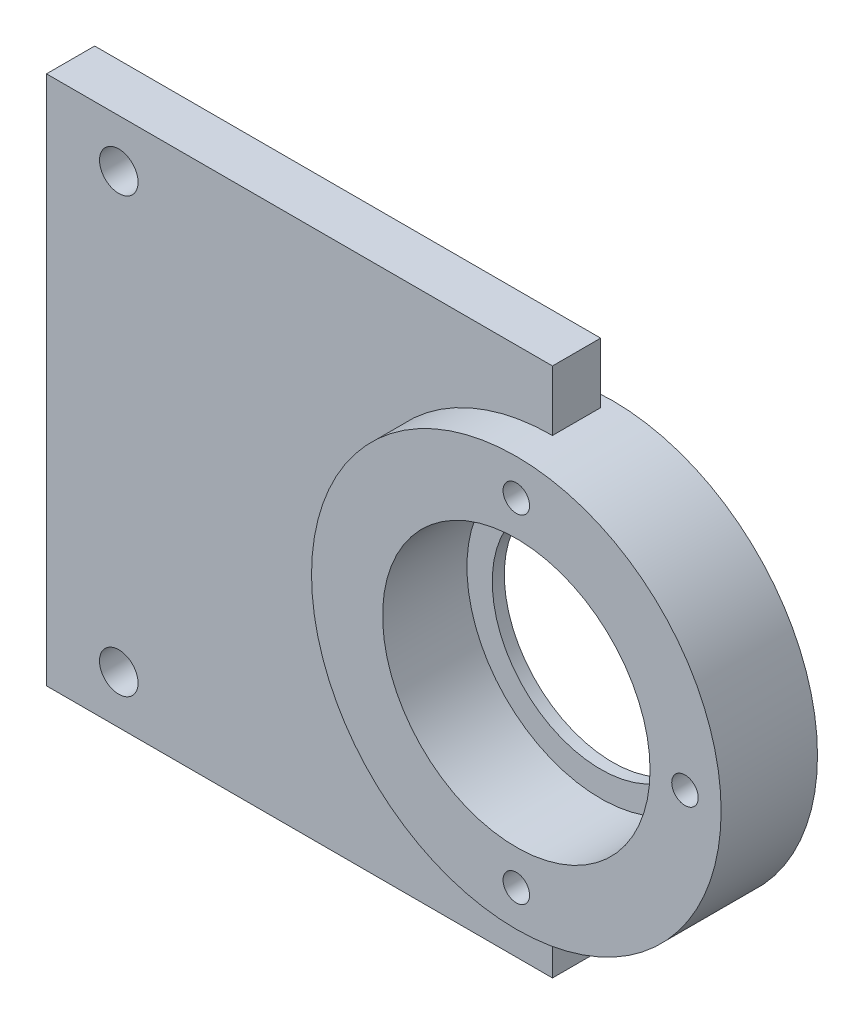
ISO-10303-21;
HEADER;
FILE_DESCRIPTION(('STEP AP214'),'2;1');
FILE_NAME('part.step','',(''),(''),'','','');
FILE_SCHEMA(('AUTOMOTIVE_DESIGN { 1 0 10303 214 1 1 1 1 }'));
ENDSEC;
DATA;
#1=APPLICATION_CONTEXT('core data for automotive mechanical design processes');
#2=APPLICATION_PROTOCOL_DEFINITION('international standard','automotive_design',2000,#1);
#3=PRODUCT_CONTEXT('',#1,'mechanical');
#4=PRODUCT('Part','Part','',(#3));
#5=PRODUCT_RELATED_PRODUCT_CATEGORY('part','',(#4));
#6=PRODUCT_DEFINITION_FORMATION('','',#4);
#7=PRODUCT_DEFINITION_CONTEXT('part definition',#1,'design');
#8=PRODUCT_DEFINITION('design','',#6,#7);
#9=PRODUCT_DEFINITION_SHAPE('','',#8);
#10=(LENGTH_UNIT() NAMED_UNIT(*) SI_UNIT(.MILLI.,.METRE.));
#11=(NAMED_UNIT(*) PLANE_ANGLE_UNIT() SI_UNIT($,.RADIAN.));
#12=(NAMED_UNIT(*) SI_UNIT($,.STERADIAN.) SOLID_ANGLE_UNIT());
#13=UNCERTAINTY_MEASURE_WITH_UNIT(LENGTH_MEASURE(1.E-05),#10,'distance_accuracy_value','');
#14=(GEOMETRIC_REPRESENTATION_CONTEXT(3) GLOBAL_UNCERTAINTY_ASSIGNED_CONTEXT((#13)) GLOBAL_UNIT_ASSIGNED_CONTEXT((#10,
#11,#12)) REPRESENTATION_CONTEXT('',''));
#15=CARTESIAN_POINT('',(0.,0.,0.));
#16=DIRECTION('',(0.,0.,1.));
#17=DIRECTION('',(1.,0.,0.));
#18=AXIS2_PLACEMENT_3D('',#15,#16,#17);
#19=CARTESIAN_POINT('',(0.,0.,0.));
#20=DIRECTION('',(0.,0.,1.));
#21=DIRECTION('',(1.,0.,0.));
#22=AXIS2_PLACEMENT_3D('',#19,#20,#21);
#23=PLANE('',#22);
#24=CARTESIAN_POINT('',(-36.,-18.,0.));
#25=DIRECTION('',(0.,0.,1.));
#26=DIRECTION('',(1.,0.,0.));
#27=AXIS2_PLACEMENT_3D('',#24,#25,#26);
#28=CIRCLE('',#27,1.6);
#29=CARTESIAN_POINT('',(-37.6,-18.,0.));
#30=VERTEX_POINT('',#29);
#31=EDGE_CURVE('E167',#30,#30,#28,.F.);
#32=ORIENTED_EDGE('',*,*,#31,.F.);
#33=EDGE_LOOP('',(#32));
#34=FACE_BOUND('',#33,.T.);
#35=CARTESIAN_POINT('',(-36.,18.,0.));
#36=DIRECTION('',(0.,0.,1.));
#37=DIRECTION('',(1.,0.,0.));
#38=AXIS2_PLACEMENT_3D('',#35,#36,#37);
#39=CIRCLE('',#38,1.6);
#40=CARTESIAN_POINT('',(-37.6,18.,0.));
#41=VERTEX_POINT('',#40);
#42=EDGE_CURVE('E161',#41,#41,#39,.F.);
#43=ORIENTED_EDGE('',*,*,#42,.F.);
#44=EDGE_LOOP('',(#43));
#45=FACE_BOUND('',#44,.T.);
#46=DIRECTION('',(0.,1.,0.));
#47=VECTOR('',#46,1.);
#48=CARTESIAN_POINT('',(0.,-22.,0.));
#49=LINE('',#48,#47);
#50=CARTESIAN_POINT('',(0.,17.,0.));
#51=VERTEX_POINT('',#50);
#52=CARTESIAN_POINT('',(0.,22.,0.));
#53=VERTEX_POINT('',#52);
#54=EDGE_CURVE('E103',#51,#53,#49,.T.);
#55=ORIENTED_EDGE('',*,*,#54,.F.);
#56=CARTESIAN_POINT('',(0.,0.,0.));
#57=DIRECTION('',(0.,0.,1.));
#58=DIRECTION('',(1.,0.,0.));
#59=AXIS2_PLACEMENT_3D('',#56,#57,#58);
#60=CIRCLE('',#59,17.);
#61=CARTESIAN_POINT('',(0.,-17.,0.));
#62=VERTEX_POINT('',#61);
#63=EDGE_CURVE('E70',#51,#62,#60,.T.);
#64=ORIENTED_EDGE('',*,*,#63,.T.);
#65=CARTESIAN_POINT('',(0.,-22.,0.));
#66=VERTEX_POINT('',#65);
#67=EDGE_CURVE('E101',#66,#62,#49,.T.);
#68=ORIENTED_EDGE('',*,*,#67,.F.);
#69=DIRECTION('',(1.,0.,0.));
#70=VECTOR('',#69,1.);
#71=CARTESIAN_POINT('',(-42.,-22.,0.));
#72=LINE('',#71,#70);
#73=CARTESIAN_POINT('',(-42.,-22.,0.));
#74=VERTEX_POINT('',#73);
#75=EDGE_CURVE('E130',#74,#66,#72,.T.);
#76=ORIENTED_EDGE('',*,*,#75,.F.);
#77=DIRECTION('',(0.,-1.,0.));
#78=VECTOR('',#77,1.);
#79=CARTESIAN_POINT('',(-42.,-22.,0.));
#80=LINE('',#79,#78);
#81=CARTESIAN_POINT('',(-42.,22.,0.));
#82=VERTEX_POINT('',#81);
#83=EDGE_CURVE('E104',#82,#74,#80,.T.);
#84=ORIENTED_EDGE('',*,*,#83,.F.);
#85=DIRECTION('',(-1.,0.,0.));
#86=VECTOR('',#85,1.);
#87=CARTESIAN_POINT('',(-42.,22.,0.));
#88=LINE('',#87,#86);
#89=EDGE_CURVE('E124',#53,#82,#88,.T.);
#90=ORIENTED_EDGE('',*,*,#89,.F.);
#91=EDGE_LOOP('',(#55,#64,#68,#76,#84,#90));
#92=FACE_BOUND('',#91,.T.);
#93=ADVANCED_FACE('F44',(#34,#45,#92),#23,.F.);
#94=CARTESIAN_POINT('',(0.,0.,7.));
#95=DIRECTION('',(0.,0.,-1.));
#96=DIRECTION('',(-1.,0.,0.));
#97=AXIS2_PLACEMENT_3D('',#94,#95,#96);
#98=CYLINDRICAL_SURFACE('',#97,17.);
#99=CARTESIAN_POINT('',(0.,0.,7.));
#100=DIRECTION('',(0.,0.,1.));
#101=DIRECTION('',(1.,0.,0.));
#102=AXIS2_PLACEMENT_3D('',#99,#100,#101);
#103=CIRCLE('',#102,17.);
#104=CARTESIAN_POINT('',(17.,0.,7.));
#105=VERTEX_POINT('',#104);
#106=EDGE_CURVE('E11',#105,#105,#103,.T.);
#107=ORIENTED_EDGE('',*,*,#106,.F.);
#108=EDGE_LOOP('',(#107));
#109=FACE_BOUND('',#108,.T.);
#110=DIRECTION('',(0.,0.,-1.));
#111=VECTOR('',#110,1.);
#112=CARTESIAN_POINT('',(0.,17.,7.));
#113=LINE('',#112,#111);
#114=CARTESIAN_POINT('',(0.,17.,4.));
#115=VERTEX_POINT('',#114);
#116=EDGE_CURVE('E111',#115,#51,#113,.T.);
#117=ORIENTED_EDGE('',*,*,#116,.F.);
#118=CARTESIAN_POINT('',(0.,0.,4.));
#119=DIRECTION('',(0.,0.,-1.));
#120=DIRECTION('',(-1.,0.,0.));
#121=AXIS2_PLACEMENT_3D('',#118,#119,#120);
#122=CIRCLE('',#121,17.);
#123=CARTESIAN_POINT('',(0.,-17.,4.));
#124=VERTEX_POINT('',#123);
#125=EDGE_CURVE('E65',#124,#115,#122,.T.);
#126=ORIENTED_EDGE('',*,*,#125,.F.);
#127=DIRECTION('',(0.,0.,-1.));
#128=VECTOR('',#127,1.);
#129=CARTESIAN_POINT('',(0.,-17.,7.));
#130=LINE('',#129,#128);
#131=EDGE_CURVE('E107',#62,#124,#130,.F.);
#132=ORIENTED_EDGE('',*,*,#131,.F.);
#133=ORIENTED_EDGE('',*,*,#63,.F.);
#134=EDGE_LOOP('',(#117,#126,#132,#133));
#135=FACE_BOUND('',#134,.T.);
#136=CARTESIAN_POINT('',(0.,0.,-1.));
#137=DIRECTION('',(0.,0.,1.));
#138=DIRECTION('',(1.,0.,0.));
#139=AXIS2_PLACEMENT_3D('',#136,#137,#138);
#140=CIRCLE('',#139,17.);
#141=CARTESIAN_POINT('',(17.,0.,-1.));
#142=VERTEX_POINT('',#141);
#143=EDGE_CURVE('E106',#142,#142,#140,.T.);
#144=ORIENTED_EDGE('',*,*,#143,.T.);
#145=EDGE_LOOP('',(#144));
#146=FACE_BOUND('',#145,.T.);
#147=ADVANCED_FACE('F50',(#109,#135,#146),#98,.T.);
#148=CARTESIAN_POINT('',(0.,0.,7.));
#149=DIRECTION('',(0.,0.,-1.));
#150=DIRECTION('',(-1.,0.,0.));
#151=AXIS2_PLACEMENT_3D('',#148,#149,#150);
#152=CYLINDRICAL_SURFACE('',#151,11.1);
#153=CARTESIAN_POINT('',(0.,0.,0.));
#154=DIRECTION('',(0.,0.,1.));
#155=DIRECTION('',(1.,0.,0.));
#156=AXIS2_PLACEMENT_3D('',#153,#154,#155);
#157=CIRCLE('',#156,11.1);
#158=CARTESIAN_POINT('',(11.1,0.,0.));
#159=VERTEX_POINT('',#158);
#160=EDGE_CURVE('E147',#159,#159,#157,.T.);
#161=ORIENTED_EDGE('',*,*,#160,.F.);
#162=EDGE_LOOP('',(#161));
#163=FACE_BOUND('',#162,.T.);
#164=CARTESIAN_POINT('',(0.,0.,7.));
#165=DIRECTION('',(0.,0.,1.));
#166=DIRECTION('',(1.,0.,0.));
#167=AXIS2_PLACEMENT_3D('',#164,#165,#166);
#168=CIRCLE('',#167,11.1);
#169=CARTESIAN_POINT('',(11.1,0.,7.));
#170=VERTEX_POINT('',#169);
#171=EDGE_CURVE('E54',#170,#170,#168,.T.);
#172=ORIENTED_EDGE('',*,*,#171,.T.);
#173=EDGE_LOOP('',(#172));
#174=FACE_BOUND('',#173,.T.);
#175=ADVANCED_FACE('F247',(#163,#174),#152,.F.);
#176=CARTESIAN_POINT('',(0.,0.,7.));
#177=DIRECTION('',(0.,0.,1.));
#178=DIRECTION('',(1.,0.,0.));
#179=AXIS2_PLACEMENT_3D('',#176,#177,#178);
#180=PLANE('',#179);
#181=CARTESIAN_POINT('',(14.,0.,7.));
#182=DIRECTION('',(0.,0.,1.));
#183=DIRECTION('',(1.,0.,0.));
#184=AXIS2_PLACEMENT_3D('',#181,#182,#183);
#185=CIRCLE('',#184,1.1);
#186=CARTESIAN_POINT('',(12.9,0.,7.));
#187=VERTEX_POINT('',#186);
#188=EDGE_CURVE('E174',#187,#187,#185,.T.);
#189=ORIENTED_EDGE('',*,*,#188,.F.);
#190=EDGE_LOOP('',(#189));
#191=FACE_BOUND('',#190,.T.);
#192=CARTESIAN_POINT('',(0.,-14.,7.));
#193=DIRECTION('',(0.,0.,1.));
#194=DIRECTION('',(1.,0.,0.));
#195=AXIS2_PLACEMENT_3D('',#192,#193,#194);
#196=CIRCLE('',#195,1.1);
#197=CARTESIAN_POINT('',(-1.1,-14.,7.));
#198=VERTEX_POINT('',#197);
#199=EDGE_CURVE('E308',#198,#198,#196,.T.);
#200=ORIENTED_EDGE('',*,*,#199,.F.);
#201=EDGE_LOOP('',(#200));
#202=FACE_BOUND('',#201,.T.);
#203=CARTESIAN_POINT('',(0.,14.,7.));
#204=DIRECTION('',(0.,0.,1.));
#205=DIRECTION('',(1.,0.,0.));
#206=AXIS2_PLACEMENT_3D('',#203,#204,#205);
#207=CIRCLE('',#206,1.1);
#208=CARTESIAN_POINT('',(-1.1,14.,7.));
#209=VERTEX_POINT('',#208);
#210=EDGE_CURVE('E309',#209,#209,#207,.T.);
#211=ORIENTED_EDGE('',*,*,#210,.F.);
#212=EDGE_LOOP('',(#211));
#213=FACE_BOUND('',#212,.T.);
#214=ORIENTED_EDGE('',*,*,#106,.T.);
#215=EDGE_LOOP('',(#214));
#216=FACE_BOUND('',#215,.T.);
#217=ORIENTED_EDGE('',*,*,#171,.F.);
#218=EDGE_LOOP('',(#217));
#219=FACE_BOUND('',#218,.T.);
#220=ADVANCED_FACE('F245',(#191,#202,#213,#216,#219),#180,.T.);
#221=CARTESIAN_POINT('',(0.,-22.,4.));
#222=DIRECTION('',(-1.,0.,0.));
#223=DIRECTION('',(0.,0.,1.));
#224=AXIS2_PLACEMENT_3D('',#221,#222,#223);
#225=PLANE('',#224);
#226=DIRECTION('',(0.,1.,0.));
#227=VECTOR('',#226,1.);
#228=CARTESIAN_POINT('',(0.,-22.,4.));
#229=LINE('',#228,#227);
#230=CARTESIAN_POINT('',(0.,22.,4.));
#231=VERTEX_POINT('',#230);
#232=EDGE_CURVE('E216',#115,#231,#229,.T.);
#233=ORIENTED_EDGE('',*,*,#232,.F.);
#234=ORIENTED_EDGE('',*,*,#116,.T.);
#235=ORIENTED_EDGE('',*,*,#54,.T.);
#236=DIRECTION('',(0.,0.,-1.));
#237=VECTOR('',#236,1.);
#238=CARTESIAN_POINT('',(0.,22.,4.));
#239=LINE('',#238,#237);
#240=EDGE_CURVE('E132',#231,#53,#239,.T.);
#241=ORIENTED_EDGE('',*,*,#240,.F.);
#242=EDGE_LOOP('',(#233,#234,#235,#241));
#243=FACE_BOUND('',#242,.T.);
#244=ADVANCED_FACE('F244',(#243),#225,.F.);
#245=ORIENTED_EDGE('',*,*,#67,.T.);
#246=ORIENTED_EDGE('',*,*,#131,.T.);
#247=CARTESIAN_POINT('',(0.,-22.,4.));
#248=VERTEX_POINT('',#247);
#249=EDGE_CURVE('E220',#248,#124,#229,.T.);
#250=ORIENTED_EDGE('',*,*,#249,.F.);
#251=DIRECTION('',(0.,0.,-1.));
#252=VECTOR('',#251,1.);
#253=CARTESIAN_POINT('',(0.,-22.,4.));
#254=LINE('',#253,#252);
#255=EDGE_CURVE('E118',#248,#66,#254,.T.);
#256=ORIENTED_EDGE('',*,*,#255,.T.);
#257=EDGE_LOOP('',(#245,#246,#250,#256));
#258=FACE_BOUND('',#257,.T.);
#259=ADVANCED_FACE('F116',(#258),#225,.F.);
#260=CARTESIAN_POINT('',(-42.,-22.,4.));
#261=DIRECTION('',(1.,0.,0.));
#262=DIRECTION('',(0.,0.,-1.));
#263=AXIS2_PLACEMENT_3D('',#260,#261,#262);
#264=PLANE('',#263);
#265=ORIENTED_EDGE('',*,*,#83,.T.);
#266=DIRECTION('',(0.,0.,-1.));
#267=VECTOR('',#266,1.);
#268=CARTESIAN_POINT('',(-42.,-22.,4.));
#269=LINE('',#268,#267);
#270=CARTESIAN_POINT('',(-42.,-22.,4.));
#271=VERTEX_POINT('',#270);
#272=EDGE_CURVE('E142',#271,#74,#269,.T.);
#273=ORIENTED_EDGE('',*,*,#272,.F.);
#274=DIRECTION('',(0.,-1.,0.));
#275=VECTOR('',#274,1.);
#276=CARTESIAN_POINT('',(-42.,-22.,4.));
#277=LINE('',#276,#275);
#278=CARTESIAN_POINT('',(-42.,22.,4.));
#279=VERTEX_POINT('',#278);
#280=EDGE_CURVE('E122',#279,#271,#277,.T.);
#281=ORIENTED_EDGE('',*,*,#280,.F.);
#282=DIRECTION('',(0.,0.,-1.));
#283=VECTOR('',#282,1.);
#284=CARTESIAN_POINT('',(-42.,22.,4.));
#285=LINE('',#284,#283);
#286=EDGE_CURVE('E134',#279,#82,#285,.T.);
#287=ORIENTED_EDGE('',*,*,#286,.T.);
#288=EDGE_LOOP('',(#265,#273,#281,#287));
#289=FACE_BOUND('',#288,.T.);
#290=ADVANCED_FACE('F232',(#289),#264,.F.);
#291=CARTESIAN_POINT('',(-42.,-22.,4.));
#292=DIRECTION('',(0.,1.,0.));
#293=DIRECTION('',(0.,0.,1.));
#294=AXIS2_PLACEMENT_3D('',#291,#292,#293);
#295=PLANE('',#294);
#296=ORIENTED_EDGE('',*,*,#75,.T.);
#297=ORIENTED_EDGE('',*,*,#255,.F.);
#298=DIRECTION('',(1.,0.,0.));
#299=VECTOR('',#298,1.);
#300=CARTESIAN_POINT('',(-42.,-22.,4.));
#301=LINE('',#300,#299);
#302=EDGE_CURVE('E213',#271,#248,#301,.T.);
#303=ORIENTED_EDGE('',*,*,#302,.F.);
#304=ORIENTED_EDGE('',*,*,#272,.T.);
#305=EDGE_LOOP('',(#296,#297,#303,#304));
#306=FACE_BOUND('',#305,.T.);
#307=ADVANCED_FACE('F230',(#306),#295,.F.);
#308=CARTESIAN_POINT('',(-42.,22.,4.));
#309=DIRECTION('',(0.,-1.,0.));
#310=DIRECTION('',(0.,0.,-1.));
#311=AXIS2_PLACEMENT_3D('',#308,#309,#310);
#312=PLANE('',#311);
#313=ORIENTED_EDGE('',*,*,#89,.T.);
#314=ORIENTED_EDGE('',*,*,#286,.F.);
#315=DIRECTION('',(-1.,0.,0.));
#316=VECTOR('',#315,1.);
#317=CARTESIAN_POINT('',(-42.,22.,4.));
#318=LINE('',#317,#316);
#319=EDGE_CURVE('E139',#231,#279,#318,.T.);
#320=ORIENTED_EDGE('',*,*,#319,.F.);
#321=ORIENTED_EDGE('',*,*,#240,.T.);
#322=EDGE_LOOP('',(#313,#314,#320,#321));
#323=FACE_BOUND('',#322,.T.);
#324=ADVANCED_FACE('F234',(#323),#312,.F.);
#325=CARTESIAN_POINT('',(0.,0.,4.));
#326=DIRECTION('',(0.,0.,-1.));
#327=DIRECTION('',(-1.,0.,0.));
#328=AXIS2_PLACEMENT_3D('',#325,#326,#327);
#329=PLANE('',#328);
#330=CARTESIAN_POINT('',(-36.,-18.,4.));
#331=DIRECTION('',(0.,0.,-1.));
#332=DIRECTION('',(-1.,0.,0.));
#333=AXIS2_PLACEMENT_3D('',#330,#331,#332);
#334=CIRCLE('',#333,1.6);
#335=CARTESIAN_POINT('',(-37.6,-18.,4.));
#336=VERTEX_POINT('',#335);
#337=EDGE_CURVE('E165',#336,#336,#334,.F.);
#338=ORIENTED_EDGE('',*,*,#337,.F.);
#339=EDGE_LOOP('',(#338));
#340=FACE_BOUND('',#339,.T.);
#341=CARTESIAN_POINT('',(-36.,18.,4.));
#342=DIRECTION('',(0.,0.,-1.));
#343=DIRECTION('',(-1.,0.,0.));
#344=AXIS2_PLACEMENT_3D('',#341,#342,#343);
#345=CIRCLE('',#344,1.6);
#346=CARTESIAN_POINT('',(-37.6,18.,4.));
#347=VERTEX_POINT('',#346);
#348=EDGE_CURVE('E160',#347,#347,#345,.F.);
#349=ORIENTED_EDGE('',*,*,#348,.F.);
#350=EDGE_LOOP('',(#349));
#351=FACE_BOUND('',#350,.T.);
#352=ORIENTED_EDGE('',*,*,#249,.T.);
#353=ORIENTED_EDGE('',*,*,#125,.T.);
#354=ORIENTED_EDGE('',*,*,#232,.T.);
#355=ORIENTED_EDGE('',*,*,#319,.T.);
#356=ORIENTED_EDGE('',*,*,#280,.T.);
#357=ORIENTED_EDGE('',*,*,#302,.T.);
#358=EDGE_LOOP('',(#352,#353,#354,#355,#356,#357));
#359=FACE_BOUND('',#358,.T.);
#360=ADVANCED_FACE('F240',(#340,#351,#359),#329,.F.);
#361=CARTESIAN_POINT('',(0.,0.,0.));
#362=DIRECTION('',(0.,0.,1.));
#363=DIRECTION('',(1.,0.,0.));
#364=AXIS2_PLACEMENT_3D('',#361,#362,#363);
#365=PLANE('',#364);
#366=ORIENTED_EDGE('',*,*,#160,.T.);
#367=EDGE_LOOP('',(#366));
#368=FACE_BOUND('',#367,.T.);
#369=CARTESIAN_POINT('',(0.,0.,0.));
#370=DIRECTION('',(0.,0.,1.));
#371=DIRECTION('',(1.,0.,0.));
#372=AXIS2_PLACEMENT_3D('',#369,#370,#371);
#373=CIRCLE('',#372,9.);
#374=CARTESIAN_POINT('',(9.,0.,0.));
#375=VERTEX_POINT('',#374);
#376=EDGE_CURVE('E200',#375,#375,#373,.T.);
#377=ORIENTED_EDGE('',*,*,#376,.F.);
#378=EDGE_LOOP('',(#377));
#379=FACE_BOUND('',#378,.T.);
#380=ADVANCED_FACE('F189',(#368,#379),#365,.T.);
#381=CARTESIAN_POINT('',(0.,0.,-1.));
#382=DIRECTION('',(0.,0.,1.));
#383=DIRECTION('',(1.,0.,0.));
#384=AXIS2_PLACEMENT_3D('',#381,#382,#383);
#385=PLANE('',#384);
#386=CARTESIAN_POINT('',(14.,0.,-1.));
#387=DIRECTION('',(0.,0.,1.));
#388=DIRECTION('',(1.,0.,0.));
#389=AXIS2_PLACEMENT_3D('',#386,#387,#388);
#390=CIRCLE('',#389,1.1);
#391=CARTESIAN_POINT('',(12.9,0.,-1.));
#392=VERTEX_POINT('',#391);
#393=EDGE_CURVE('E47',#392,#392,#390,.F.);
#394=ORIENTED_EDGE('',*,*,#393,.F.);
#395=EDGE_LOOP('',(#394));
#396=FACE_BOUND('',#395,.T.);
#397=CARTESIAN_POINT('',(0.,-14.,-1.));
#398=DIRECTION('',(0.,0.,1.));
#399=DIRECTION('',(1.,0.,0.));
#400=AXIS2_PLACEMENT_3D('',#397,#398,#399);
#401=CIRCLE('',#400,1.1);
#402=CARTESIAN_POINT('',(-1.1,-14.,-1.));
#403=VERTEX_POINT('',#402);
#404=EDGE_CURVE('E168',#403,#403,#401,.F.);
#405=ORIENTED_EDGE('',*,*,#404,.F.);
#406=EDGE_LOOP('',(#405));
#407=FACE_BOUND('',#406,.T.);
#408=CARTESIAN_POINT('',(0.,14.,-1.));
#409=DIRECTION('',(0.,0.,1.));
#410=DIRECTION('',(1.,0.,0.));
#411=AXIS2_PLACEMENT_3D('',#408,#409,#410);
#412=CIRCLE('',#411,1.1);
#413=CARTESIAN_POINT('',(-1.1,14.,-1.));
#414=VERTEX_POINT('',#413);
#415=EDGE_CURVE('E170',#414,#414,#412,.F.);
#416=ORIENTED_EDGE('',*,*,#415,.F.);
#417=EDGE_LOOP('',(#416));
#418=FACE_BOUND('',#417,.T.);
#419=ORIENTED_EDGE('',*,*,#143,.F.);
#420=EDGE_LOOP('',(#419));
#421=FACE_BOUND('',#420,.T.);
#422=CARTESIAN_POINT('',(0.,0.,-1.));
#423=DIRECTION('',(0.,0.,1.));
#424=DIRECTION('',(1.,0.,0.));
#425=AXIS2_PLACEMENT_3D('',#422,#423,#424);
#426=CIRCLE('',#425,9.);
#427=CARTESIAN_POINT('',(9.,0.,-1.));
#428=VERTEX_POINT('',#427);
#429=EDGE_CURVE('E198',#428,#428,#426,.T.);
#430=ORIENTED_EDGE('',*,*,#429,.T.);
#431=EDGE_LOOP('',(#430));
#432=FACE_BOUND('',#431,.T.);
#433=ADVANCED_FACE('F185',(#396,#407,#418,#421,#432),#385,.F.);
#434=CARTESIAN_POINT('',(0.,0.,0.));
#435=DIRECTION('',(0.,0.,-1.));
#436=DIRECTION('',(-1.,0.,0.));
#437=AXIS2_PLACEMENT_3D('',#434,#435,#436);
#438=CYLINDRICAL_SURFACE('',#437,9.);
#439=ORIENTED_EDGE('',*,*,#376,.T.);
#440=EDGE_LOOP('',(#439));
#441=FACE_BOUND('',#440,.T.);
#442=ORIENTED_EDGE('',*,*,#429,.F.);
#443=EDGE_LOOP('',(#442));
#444=FACE_BOUND('',#443,.T.);
#445=ADVANCED_FACE('F183',(#441,#444),#438,.F.);
#446=CARTESIAN_POINT('',(-36.,18.,7.));
#447=DIRECTION('',(0.,0.,-1.));
#448=DIRECTION('',(-1.,0.,0.));
#449=AXIS2_PLACEMENT_3D('',#446,#447,#448);
#450=CYLINDRICAL_SURFACE('',#449,1.6);
#451=CARTESIAN_POINT('',(-37.6,18.,4.));
#452=CARTESIAN_POINT('',(-37.6,18.,3.95833333333333));
#453=CARTESIAN_POINT('',(-37.6,18.,3.91666666666667));
#454=CARTESIAN_POINT('',(-37.6,18.,3.83333333333333));
#455=CARTESIAN_POINT('',(-37.6,18.,3.79166666666667));
#456=CARTESIAN_POINT('',(-37.6,18.,3.70833333333333));
#457=CARTESIAN_POINT('',(-37.6,18.,3.66666666666667));
#458=CARTESIAN_POINT('',(-37.6,18.,3.58333333333333));
#459=CARTESIAN_POINT('',(-37.6,18.,3.54166666666667));
#460=CARTESIAN_POINT('',(-37.6,18.,3.45833333333333));
#461=CARTESIAN_POINT('',(-37.6,18.,3.41666666666667));
#462=CARTESIAN_POINT('',(-37.6,18.,3.33333333333333));
#463=CARTESIAN_POINT('',(-37.6,18.,3.29166666666667));
#464=CARTESIAN_POINT('',(-37.6,18.,3.20833333333333));
#465=CARTESIAN_POINT('',(-37.6,18.,3.16666666666667));
#466=CARTESIAN_POINT('',(-37.6,18.,3.08333333333333));
#467=CARTESIAN_POINT('',(-37.6,18.,3.04166666666667));
#468=CARTESIAN_POINT('',(-37.6,18.,2.95833333333333));
#469=CARTESIAN_POINT('',(-37.6,18.,2.91666666666667));
#470=CARTESIAN_POINT('',(-37.6,18.,2.83333333333333));
#471=CARTESIAN_POINT('',(-37.6,18.,2.79166666666667));
#472=CARTESIAN_POINT('',(-37.6,18.,2.70833333333333));
#473=CARTESIAN_POINT('',(-37.6,18.,2.66666666666667));
#474=CARTESIAN_POINT('',(-37.6,18.,2.58333333333333));
#475=CARTESIAN_POINT('',(-37.6,18.,2.54166666666667));
#476=CARTESIAN_POINT('',(-37.6,18.,2.45833333333333));
#477=CARTESIAN_POINT('',(-37.6,18.,2.41666666666667));
#478=CARTESIAN_POINT('',(-37.6,18.,2.33333333333333));
#479=CARTESIAN_POINT('',(-37.6,18.,2.29166666666667));
#480=CARTESIAN_POINT('',(-37.6,18.,2.20833333333333));
#481=CARTESIAN_POINT('',(-37.6,18.,2.16666666666667));
#482=CARTESIAN_POINT('',(-37.6,18.,2.08333333333333));
#483=CARTESIAN_POINT('',(-37.6,18.,2.04166666666667));
#484=CARTESIAN_POINT('',(-37.6,18.,1.95833333333333));
#485=CARTESIAN_POINT('',(-37.6,18.,1.91666666666667));
#486=CARTESIAN_POINT('',(-37.6,18.,1.83333333333333));
#487=CARTESIAN_POINT('',(-37.6,18.,1.79166666666667));
#488=CARTESIAN_POINT('',(-37.6,18.,1.70833333333333));
#489=CARTESIAN_POINT('',(-37.6,18.,1.66666666666667));
#490=CARTESIAN_POINT('',(-37.6,18.,1.58333333333333));
#491=CARTESIAN_POINT('',(-37.6,18.,1.54166666666667));
#492=CARTESIAN_POINT('',(-37.6,18.,1.45833333333333));
#493=CARTESIAN_POINT('',(-37.6,18.,1.41666666666667));
#494=CARTESIAN_POINT('',(-37.6,18.,1.33333333333333));
#495=CARTESIAN_POINT('',(-37.6,18.,1.29166666666667));
#496=CARTESIAN_POINT('',(-37.6,18.,1.20833333333333));
#497=CARTESIAN_POINT('',(-37.6,18.,1.16666666666667));
#498=CARTESIAN_POINT('',(-37.6,18.,1.08333333333333));
#499=CARTESIAN_POINT('',(-37.6,18.,1.04166666666667));
#500=CARTESIAN_POINT('',(-37.6,18.,0.958333333333333));
#501=CARTESIAN_POINT('',(-37.6,18.,0.916666666666667));
#502=CARTESIAN_POINT('',(-37.6,18.,0.833333333333333));
#503=CARTESIAN_POINT('',(-37.6,18.,0.791666666666667));
#504=CARTESIAN_POINT('',(-37.6,18.,0.708333333333333));
#505=CARTESIAN_POINT('',(-37.6,18.,0.666666666666666));
#506=CARTESIAN_POINT('',(-37.6,18.,0.583333333333333));
#507=CARTESIAN_POINT('',(-37.6,18.,0.541666666666666));
#508=CARTESIAN_POINT('',(-37.6,18.,0.458333333333333));
#509=CARTESIAN_POINT('',(-37.6,18.,0.416666666666666));
#510=CARTESIAN_POINT('',(-37.6,18.,0.333333333333333));
#511=CARTESIAN_POINT('',(-37.6,18.,0.291666666666666));
#512=CARTESIAN_POINT('',(-37.6,18.,0.208333333333333));
#513=CARTESIAN_POINT('',(-37.6,18.,0.166666666666666));
#514=CARTESIAN_POINT('',(-37.6,18.,0.0833333333333325));
#515=CARTESIAN_POINT('',(-37.6,18.,0.0416666666666658));
#516=CARTESIAN_POINT('',(-37.6,18.,0.));
#517=B_SPLINE_CURVE_WITH_KNOTS('',3,(#451,#452,#453,#454,#455,#456,#457,#458,#459,#460,#461,
#462,#463,#464,#465,#466,#467,#468,#469,#470,#471,#472,#473,#474,#475,#476,#477,#478,#479,#480,
#481,#482,#483,#484,#485,#486,#487,#488,#489,#490,#491,#492,#493,#494,#495,#496,#497,#498,#499,
#500,#501,#502,#503,#504,#505,#506,#507,#508,#509,#510,#511,#512,#513,#514,#515,#516),
.UNSPECIFIED.,.F.,.F.,(4,2,2,2,2,2,2,2,2,2,2,2,2,2,2,2,2,2,2,2,2,2,2,2,2,2,2,2,2,2,2,2,4),(0.,
0.125,0.25,0.375,0.5,0.625,0.75,0.875,1.,1.125,1.25,1.375,1.5,1.625,1.75,1.875,2.,2.125,2.25,
2.375,2.5,2.625,2.75,2.875,3.,3.125,3.25,3.375,3.5,3.625,3.75,3.875,4.),.UNSPECIFIED.);
#518=EDGE_CURVE('BSEAM281',#347,#41,#517,.T.);
#519=ORIENTED_EDGE('',*,*,#348,.T.);
#520=ORIENTED_EDGE('',*,*,#42,.T.);
#521=ORIENTED_EDGE('',*,*,#518,.T.);
#522=ORIENTED_EDGE('',*,*,#518,.F.);
#523=EDGE_LOOP('',(#519,#521,#520,#522));
#524=FACE_BOUND('',#523,.T.);
#525=ADVANCED_FACE('F281',(#524),#450,.F.);
#526=CARTESIAN_POINT('',(-36.,-18.,7.));
#527=DIRECTION('',(0.,0.,-1.));
#528=DIRECTION('',(-1.,0.,0.));
#529=AXIS2_PLACEMENT_3D('',#526,#527,#528);
#530=CYLINDRICAL_SURFACE('',#529,1.6);
#531=CARTESIAN_POINT('',(-37.6,-18.,4.));
#532=CARTESIAN_POINT('',(-37.6,-18.,3.95833333333333));
#533=CARTESIAN_POINT('',(-37.6,-18.,3.91666666666667));
#534=CARTESIAN_POINT('',(-37.6,-18.,3.83333333333333));
#535=CARTESIAN_POINT('',(-37.6,-18.,3.79166666666667));
#536=CARTESIAN_POINT('',(-37.6,-18.,3.70833333333333));
#537=CARTESIAN_POINT('',(-37.6,-18.,3.66666666666667));
#538=CARTESIAN_POINT('',(-37.6,-18.,3.58333333333333));
#539=CARTESIAN_POINT('',(-37.6,-18.,3.54166666666667));
#540=CARTESIAN_POINT('',(-37.6,-18.,3.45833333333333));
#541=CARTESIAN_POINT('',(-37.6,-18.,3.41666666666667));
#542=CARTESIAN_POINT('',(-37.6,-18.,3.33333333333333));
#543=CARTESIAN_POINT('',(-37.6,-18.,3.29166666666667));
#544=CARTESIAN_POINT('',(-37.6,-18.,3.20833333333333));
#545=CARTESIAN_POINT('',(-37.6,-18.,3.16666666666667));
#546=CARTESIAN_POINT('',(-37.6,-18.,3.08333333333333));
#547=CARTESIAN_POINT('',(-37.6,-18.,3.04166666666667));
#548=CARTESIAN_POINT('',(-37.6,-18.,2.95833333333333));
#549=CARTESIAN_POINT('',(-37.6,-18.,2.91666666666667));
#550=CARTESIAN_POINT('',(-37.6,-18.,2.83333333333333));
#551=CARTESIAN_POINT('',(-37.6,-18.,2.79166666666667));
#552=CARTESIAN_POINT('',(-37.6,-18.,2.70833333333333));
#553=CARTESIAN_POINT('',(-37.6,-18.,2.66666666666667));
#554=CARTESIAN_POINT('',(-37.6,-18.,2.58333333333333));
#555=CARTESIAN_POINT('',(-37.6,-18.,2.54166666666667));
#556=CARTESIAN_POINT('',(-37.6,-18.,2.45833333333333));
#557=CARTESIAN_POINT('',(-37.6,-18.,2.41666666666667));
#558=CARTESIAN_POINT('',(-37.6,-18.,2.33333333333333));
#559=CARTESIAN_POINT('',(-37.6,-18.,2.29166666666667));
#560=CARTESIAN_POINT('',(-37.6,-18.,2.20833333333333));
#561=CARTESIAN_POINT('',(-37.6,-18.,2.16666666666667));
#562=CARTESIAN_POINT('',(-37.6,-18.,2.08333333333333));
#563=CARTESIAN_POINT('',(-37.6,-18.,2.04166666666667));
#564=CARTESIAN_POINT('',(-37.6,-18.,1.95833333333333));
#565=CARTESIAN_POINT('',(-37.6,-18.,1.91666666666667));
#566=CARTESIAN_POINT('',(-37.6,-18.,1.83333333333333));
#567=CARTESIAN_POINT('',(-37.6,-18.,1.79166666666667));
#568=CARTESIAN_POINT('',(-37.6,-18.,1.70833333333333));
#569=CARTESIAN_POINT('',(-37.6,-18.,1.66666666666667));
#570=CARTESIAN_POINT('',(-37.6,-18.,1.58333333333333));
#571=CARTESIAN_POINT('',(-37.6,-18.,1.54166666666667));
#572=CARTESIAN_POINT('',(-37.6,-18.,1.45833333333333));
#573=CARTESIAN_POINT('',(-37.6,-18.,1.41666666666667));
#574=CARTESIAN_POINT('',(-37.6,-18.,1.33333333333333));
#575=CARTESIAN_POINT('',(-37.6,-18.,1.29166666666667));
#576=CARTESIAN_POINT('',(-37.6,-18.,1.20833333333333));
#577=CARTESIAN_POINT('',(-37.6,-18.,1.16666666666667));
#578=CARTESIAN_POINT('',(-37.6,-18.,1.08333333333333));
#579=CARTESIAN_POINT('',(-37.6,-18.,1.04166666666667));
#580=CARTESIAN_POINT('',(-37.6,-18.,0.958333333333333));
#581=CARTESIAN_POINT('',(-37.6,-18.,0.916666666666667));
#582=CARTESIAN_POINT('',(-37.6,-18.,0.833333333333333));
#583=CARTESIAN_POINT('',(-37.6,-18.,0.791666666666667));
#584=CARTESIAN_POINT('',(-37.6,-18.,0.708333333333333));
#585=CARTESIAN_POINT('',(-37.6,-18.,0.666666666666666));
#586=CARTESIAN_POINT('',(-37.6,-18.,0.583333333333333));
#587=CARTESIAN_POINT('',(-37.6,-18.,0.541666666666666));
#588=CARTESIAN_POINT('',(-37.6,-18.,0.458333333333333));
#589=CARTESIAN_POINT('',(-37.6,-18.,0.416666666666666));
#590=CARTESIAN_POINT('',(-37.6,-18.,0.333333333333333));
#591=CARTESIAN_POINT('',(-37.6,-18.,0.291666666666666));
#592=CARTESIAN_POINT('',(-37.6,-18.,0.208333333333333));
#593=CARTESIAN_POINT('',(-37.6,-18.,0.166666666666666));
#594=CARTESIAN_POINT('',(-37.6,-18.,0.0833333333333325));
#595=CARTESIAN_POINT('',(-37.6,-18.,0.0416666666666658));
#596=CARTESIAN_POINT('',(-37.6,-18.,0.));
#597=B_SPLINE_CURVE_WITH_KNOTS('',3,(#531,#532,#533,#534,#535,#536,#537,#538,#539,#540,#541,
#542,#543,#544,#545,#546,#547,#548,#549,#550,#551,#552,#553,#554,#555,#556,#557,#558,#559,#560,
#561,#562,#563,#564,#565,#566,#567,#568,#569,#570,#571,#572,#573,#574,#575,#576,#577,#578,#579,
#580,#581,#582,#583,#584,#585,#586,#587,#588,#589,#590,#591,#592,#593,#594,#595,#596),
.UNSPECIFIED.,.F.,.F.,(4,2,2,2,2,2,2,2,2,2,2,2,2,2,2,2,2,2,2,2,2,2,2,2,2,2,2,2,2,2,2,2,4),(0.,
0.125,0.25,0.375,0.5,0.625,0.75,0.875,1.,1.125,1.25,1.375,1.5,1.625,1.75,1.875,2.,2.125,2.25,
2.375,2.5,2.625,2.75,2.875,3.,3.125,3.25,3.375,3.5,3.625,3.75,3.875,4.),.UNSPECIFIED.);
#598=EDGE_CURVE('BSEAM289',#336,#30,#597,.T.);
#599=ORIENTED_EDGE('',*,*,#337,.T.);
#600=ORIENTED_EDGE('',*,*,#31,.T.);
#601=ORIENTED_EDGE('',*,*,#598,.T.);
#602=ORIENTED_EDGE('',*,*,#598,.F.);
#603=EDGE_LOOP('',(#599,#601,#600,#602));
#604=FACE_BOUND('',#603,.T.);
#605=ADVANCED_FACE('F289',(#604),#530,.F.);
#606=CARTESIAN_POINT('',(0.,14.,7.));
#607=DIRECTION('',(0.,0.,-1.));
#608=DIRECTION('',(-1.,0.,0.));
#609=AXIS2_PLACEMENT_3D('',#606,#607,#608);
#610=CYLINDRICAL_SURFACE('',#609,1.1);
#611=CARTESIAN_POINT('',(-1.1,14.,7.));
#612=CARTESIAN_POINT('',(-1.1,14.,6.91666666666667));
#613=CARTESIAN_POINT('',(-1.1,14.,6.83333333333333));
#614=CARTESIAN_POINT('',(-1.1,14.,6.66666666666667));
#615=CARTESIAN_POINT('',(-1.1,14.,6.58333333333333));
#616=CARTESIAN_POINT('',(-1.1,14.,6.41666666666667));
#617=CARTESIAN_POINT('',(-1.1,14.,6.33333333333333));
#618=CARTESIAN_POINT('',(-1.1,14.,6.16666666666667));
#619=CARTESIAN_POINT('',(-1.1,14.,6.08333333333333));
#620=CARTESIAN_POINT('',(-1.1,14.,5.91666666666666));
#621=CARTESIAN_POINT('',(-1.1,14.,5.83333333333333));
#622=CARTESIAN_POINT('',(-1.1,14.,5.66666666666666));
#623=CARTESIAN_POINT('',(-1.1,14.,5.58333333333333));
#624=CARTESIAN_POINT('',(-1.1,14.,5.41666666666667));
#625=CARTESIAN_POINT('',(-1.1,14.,5.33333333333333));
#626=CARTESIAN_POINT('',(-1.1,14.,5.16666666666667));
#627=CARTESIAN_POINT('',(-1.1,14.,5.08333333333333));
#628=CARTESIAN_POINT('',(-1.1,14.,4.91666666666666));
#629=CARTESIAN_POINT('',(-1.1,14.,4.83333333333333));
#630=CARTESIAN_POINT('',(-1.1,14.,4.66666666666666));
#631=CARTESIAN_POINT('',(-1.1,14.,4.58333333333333));
#632=CARTESIAN_POINT('',(-1.1,14.,4.41666666666667));
#633=CARTESIAN_POINT('',(-1.1,14.,4.33333333333333));
#634=CARTESIAN_POINT('',(-1.1,14.,4.16666666666667));
#635=CARTESIAN_POINT('',(-1.1,14.,4.08333333333333));
#636=CARTESIAN_POINT('',(-1.1,14.,3.91666666666666));
#637=CARTESIAN_POINT('',(-1.1,14.,3.83333333333333));
#638=CARTESIAN_POINT('',(-1.1,14.,3.66666666666666));
#639=CARTESIAN_POINT('',(-1.1,14.,3.58333333333333));
#640=CARTESIAN_POINT('',(-1.1,14.,3.41666666666666));
#641=CARTESIAN_POINT('',(-1.1,14.,3.33333333333333));
#642=CARTESIAN_POINT('',(-1.1,14.,3.16666666666666));
#643=CARTESIAN_POINT('',(-1.1,14.,3.08333333333333));
#644=CARTESIAN_POINT('',(-1.1,14.,2.91666666666667));
#645=CARTESIAN_POINT('',(-1.1,14.,2.83333333333333));
#646=CARTESIAN_POINT('',(-1.1,14.,2.66666666666666));
#647=CARTESIAN_POINT('',(-1.1,14.,2.58333333333333));
#648=CARTESIAN_POINT('',(-1.1,14.,2.41666666666666));
#649=CARTESIAN_POINT('',(-1.1,14.,2.33333333333333));
#650=CARTESIAN_POINT('',(-1.1,14.,2.16666666666666));
#651=CARTESIAN_POINT('',(-1.1,14.,2.08333333333333));
#652=CARTESIAN_POINT('',(-1.1,14.,1.91666666666666));
#653=CARTESIAN_POINT('',(-1.1,14.,1.83333333333333));
#654=CARTESIAN_POINT('',(-1.1,14.,1.66666666666666));
#655=CARTESIAN_POINT('',(-1.1,14.,1.58333333333333));
#656=CARTESIAN_POINT('',(-1.1,14.,1.41666666666666));
#657=CARTESIAN_POINT('',(-1.1,14.,1.33333333333333));
#658=CARTESIAN_POINT('',(-1.1,14.,1.16666666666666));
#659=CARTESIAN_POINT('',(-1.1,14.,1.08333333333333));
#660=CARTESIAN_POINT('',(-1.1,14.,0.916666666666664));
#661=CARTESIAN_POINT('',(-1.1,14.,0.833333333333331));
#662=CARTESIAN_POINT('',(-1.1,14.,0.666666666666664));
#663=CARTESIAN_POINT('',(-1.1,14.,0.58333333333333));
#664=CARTESIAN_POINT('',(-1.1,14.,0.416666666666664));
#665=CARTESIAN_POINT('',(-1.1,14.,0.33333333333333));
#666=CARTESIAN_POINT('',(-1.1,14.,0.166666666666664));
#667=CARTESIAN_POINT('',(-1.1,14.,0.0833333333333305));
#668=CARTESIAN_POINT('',(-1.1,14.,-0.083333333333336));
#669=CARTESIAN_POINT('',(-1.1,14.,-0.166666666666669));
#670=CARTESIAN_POINT('',(-1.1,14.,-0.333333333333336));
#671=CARTESIAN_POINT('',(-1.1,14.,-0.41666666666667));
#672=CARTESIAN_POINT('',(-1.1,14.,-0.583333333333336));
#673=CARTESIAN_POINT('',(-1.1,14.,-0.66666666666667));
#674=CARTESIAN_POINT('',(-1.1,14.,-0.833333333333336));
#675=CARTESIAN_POINT('',(-1.1,14.,-0.91666666666667));
#676=CARTESIAN_POINT('',(-1.1,14.,-1.));
#677=B_SPLINE_CURVE_WITH_KNOTS('',3,(#611,#612,#613,#614,#615,#616,#617,#618,#619,#620,#621,
#622,#623,#624,#625,#626,#627,#628,#629,#630,#631,#632,#633,#634,#635,#636,#637,#638,#639,#640,
#641,#642,#643,#644,#645,#646,#647,#648,#649,#650,#651,#652,#653,#654,#655,#656,#657,#658,#659,
#660,#661,#662,#663,#664,#665,#666,#667,#668,#669,#670,#671,#672,#673,#674,#675,#676),
.UNSPECIFIED.,.F.,.F.,(4,2,2,2,2,2,2,2,2,2,2,2,2,2,2,2,2,2,2,2,2,2,2,2,2,2,2,2,2,2,2,2,4),(0.,
0.25,0.5,0.750000000000001,1.,1.25,1.5,1.75,2.,2.25,2.5,2.75,3.,3.25,3.5,3.75,4.,4.25,4.5,4.75,
5.,5.25,5.5,5.75,6.,6.25,6.5,6.75,7.,7.25,7.5,7.75,8.),.UNSPECIFIED.);
#678=EDGE_CURVE('BSEAM287',#209,#414,#677,.T.);
#679=ORIENTED_EDGE('',*,*,#210,.T.);
#680=ORIENTED_EDGE('',*,*,#415,.T.);
#681=ORIENTED_EDGE('',*,*,#678,.T.);
#682=ORIENTED_EDGE('',*,*,#678,.F.);
#683=EDGE_LOOP('',(#679,#681,#680,#682));
#684=FACE_BOUND('',#683,.T.);
#685=ADVANCED_FACE('F287',(#684),#610,.F.);
#686=CARTESIAN_POINT('',(0.,-14.,7.));
#687=DIRECTION('',(0.,0.,-1.));
#688=DIRECTION('',(-1.,0.,0.));
#689=AXIS2_PLACEMENT_3D('',#686,#687,#688);
#690=CYLINDRICAL_SURFACE('',#689,1.1);
#691=CARTESIAN_POINT('',(-1.1,-14.,7.));
#692=CARTESIAN_POINT('',(-1.1,-14.,6.91666666666667));
#693=CARTESIAN_POINT('',(-1.1,-14.,6.83333333333333));
#694=CARTESIAN_POINT('',(-1.1,-14.,6.66666666666667));
#695=CARTESIAN_POINT('',(-1.1,-14.,6.58333333333333));
#696=CARTESIAN_POINT('',(-1.1,-14.,6.41666666666667));
#697=CARTESIAN_POINT('',(-1.1,-14.,6.33333333333333));
#698=CARTESIAN_POINT('',(-1.1,-14.,6.16666666666667));
#699=CARTESIAN_POINT('',(-1.1,-14.,6.08333333333333));
#700=CARTESIAN_POINT('',(-1.1,-14.,5.91666666666666));
#701=CARTESIAN_POINT('',(-1.1,-14.,5.83333333333333));
#702=CARTESIAN_POINT('',(-1.1,-14.,5.66666666666666));
#703=CARTESIAN_POINT('',(-1.1,-14.,5.58333333333333));
#704=CARTESIAN_POINT('',(-1.1,-14.,5.41666666666667));
#705=CARTESIAN_POINT('',(-1.1,-14.,5.33333333333333));
#706=CARTESIAN_POINT('',(-1.1,-14.,5.16666666666667));
#707=CARTESIAN_POINT('',(-1.1,-14.,5.08333333333333));
#708=CARTESIAN_POINT('',(-1.1,-14.,4.91666666666666));
#709=CARTESIAN_POINT('',(-1.1,-14.,4.83333333333333));
#710=CARTESIAN_POINT('',(-1.1,-14.,4.66666666666666));
#711=CARTESIAN_POINT('',(-1.1,-14.,4.58333333333333));
#712=CARTESIAN_POINT('',(-1.1,-14.,4.41666666666667));
#713=CARTESIAN_POINT('',(-1.1,-14.,4.33333333333333));
#714=CARTESIAN_POINT('',(-1.1,-14.,4.16666666666667));
#715=CARTESIAN_POINT('',(-1.1,-14.,4.08333333333333));
#716=CARTESIAN_POINT('',(-1.1,-14.,3.91666666666666));
#717=CARTESIAN_POINT('',(-1.1,-14.,3.83333333333333));
#718=CARTESIAN_POINT('',(-1.1,-14.,3.66666666666666));
#719=CARTESIAN_POINT('',(-1.1,-14.,3.58333333333333));
#720=CARTESIAN_POINT('',(-1.1,-14.,3.41666666666666));
#721=CARTESIAN_POINT('',(-1.1,-14.,3.33333333333333));
#722=CARTESIAN_POINT('',(-1.1,-14.,3.16666666666666));
#723=CARTESIAN_POINT('',(-1.1,-14.,3.08333333333333));
#724=CARTESIAN_POINT('',(-1.1,-14.,2.91666666666667));
#725=CARTESIAN_POINT('',(-1.1,-14.,2.83333333333333));
#726=CARTESIAN_POINT('',(-1.1,-14.,2.66666666666666));
#727=CARTESIAN_POINT('',(-1.1,-14.,2.58333333333333));
#728=CARTESIAN_POINT('',(-1.1,-14.,2.41666666666666));
#729=CARTESIAN_POINT('',(-1.1,-14.,2.33333333333333));
#730=CARTESIAN_POINT('',(-1.1,-14.,2.16666666666666));
#731=CARTESIAN_POINT('',(-1.1,-14.,2.08333333333333));
#732=CARTESIAN_POINT('',(-1.1,-14.,1.91666666666666));
#733=CARTESIAN_POINT('',(-1.1,-14.,1.83333333333333));
#734=CARTESIAN_POINT('',(-1.1,-14.,1.66666666666666));
#735=CARTESIAN_POINT('',(-1.1,-14.,1.58333333333333));
#736=CARTESIAN_POINT('',(-1.1,-14.,1.41666666666666));
#737=CARTESIAN_POINT('',(-1.1,-14.,1.33333333333333));
#738=CARTESIAN_POINT('',(-1.1,-14.,1.16666666666666));
#739=CARTESIAN_POINT('',(-1.1,-14.,1.08333333333333));
#740=CARTESIAN_POINT('',(-1.1,-14.,0.916666666666664));
#741=CARTESIAN_POINT('',(-1.1,-14.,0.833333333333331));
#742=CARTESIAN_POINT('',(-1.1,-14.,0.666666666666664));
#743=CARTESIAN_POINT('',(-1.1,-14.,0.58333333333333));
#744=CARTESIAN_POINT('',(-1.1,-14.,0.416666666666664));
#745=CARTESIAN_POINT('',(-1.1,-14.,0.33333333333333));
#746=CARTESIAN_POINT('',(-1.1,-14.,0.166666666666664));
#747=CARTESIAN_POINT('',(-1.1,-14.,0.0833333333333305));
#748=CARTESIAN_POINT('',(-1.1,-14.,-0.083333333333336));
#749=CARTESIAN_POINT('',(-1.1,-14.,-0.166666666666669));
#750=CARTESIAN_POINT('',(-1.1,-14.,-0.333333333333336));
#751=CARTESIAN_POINT('',(-1.1,-14.,-0.41666666666667));
#752=CARTESIAN_POINT('',(-1.1,-14.,-0.583333333333336));
#753=CARTESIAN_POINT('',(-1.1,-14.,-0.66666666666667));
#754=CARTESIAN_POINT('',(-1.1,-14.,-0.833333333333336));
#755=CARTESIAN_POINT('',(-1.1,-14.,-0.91666666666667));
#756=CARTESIAN_POINT('',(-1.1,-14.,-1.));
#757=B_SPLINE_CURVE_WITH_KNOTS('',3,(#691,#692,#693,#694,#695,#696,#697,#698,#699,#700,#701,
#702,#703,#704,#705,#706,#707,#708,#709,#710,#711,#712,#713,#714,#715,#716,#717,#718,#719,#720,
#721,#722,#723,#724,#725,#726,#727,#728,#729,#730,#731,#732,#733,#734,#735,#736,#737,#738,#739,
#740,#741,#742,#743,#744,#745,#746,#747,#748,#749,#750,#751,#752,#753,#754,#755,#756),
.UNSPECIFIED.,.F.,.F.,(4,2,2,2,2,2,2,2,2,2,2,2,2,2,2,2,2,2,2,2,2,2,2,2,2,2,2,2,2,2,2,2,4),(0.,
0.25,0.5,0.750000000000001,1.,1.25,1.5,1.75,2.,2.25,2.5,2.75,3.,3.25,3.5,3.75,4.,4.25,4.5,4.75,
5.,5.25,5.5,5.75,6.,6.25,6.5,6.75,7.,7.25,7.5,7.75,8.),.UNSPECIFIED.);
#758=EDGE_CURVE('BSEAM294',#198,#403,#757,.T.);
#759=ORIENTED_EDGE('',*,*,#199,.T.);
#760=ORIENTED_EDGE('',*,*,#404,.T.);
#761=ORIENTED_EDGE('',*,*,#758,.T.);
#762=ORIENTED_EDGE('',*,*,#758,.F.);
#763=EDGE_LOOP('',(#759,#761,#760,#762));
#764=FACE_BOUND('',#763,.T.);
#765=ADVANCED_FACE('F294',(#764),#690,.F.);
#766=CARTESIAN_POINT('',(14.,0.,7.));
#767=DIRECTION('',(0.,0.,-1.));
#768=DIRECTION('',(-1.,0.,0.));
#769=AXIS2_PLACEMENT_3D('',#766,#767,#768);
#770=CYLINDRICAL_SURFACE('',#769,1.1);
#771=CARTESIAN_POINT('',(12.9,0.,7.));
#772=CARTESIAN_POINT('',(12.9,0.,6.91666666666667));
#773=CARTESIAN_POINT('',(12.9,0.,6.83333333333333));
#774=CARTESIAN_POINT('',(12.9,0.,6.66666666666667));
#775=CARTESIAN_POINT('',(12.9,0.,6.58333333333333));
#776=CARTESIAN_POINT('',(12.9,0.,6.41666666666667));
#777=CARTESIAN_POINT('',(12.9,0.,6.33333333333333));
#778=CARTESIAN_POINT('',(12.9,0.,6.16666666666667));
#779=CARTESIAN_POINT('',(12.9,0.,6.08333333333333));
#780=CARTESIAN_POINT('',(12.9,0.,5.91666666666666));
#781=CARTESIAN_POINT('',(12.9,0.,5.83333333333333));
#782=CARTESIAN_POINT('',(12.9,0.,5.66666666666666));
#783=CARTESIAN_POINT('',(12.9,0.,5.58333333333333));
#784=CARTESIAN_POINT('',(12.9,0.,5.41666666666667));
#785=CARTESIAN_POINT('',(12.9,0.,5.33333333333333));
#786=CARTESIAN_POINT('',(12.9,0.,5.16666666666667));
#787=CARTESIAN_POINT('',(12.9,0.,5.08333333333333));
#788=CARTESIAN_POINT('',(12.9,0.,4.91666666666666));
#789=CARTESIAN_POINT('',(12.9,0.,4.83333333333333));
#790=CARTESIAN_POINT('',(12.9,0.,4.66666666666666));
#791=CARTESIAN_POINT('',(12.9,0.,4.58333333333333));
#792=CARTESIAN_POINT('',(12.9,0.,4.41666666666667));
#793=CARTESIAN_POINT('',(12.9,0.,4.33333333333333));
#794=CARTESIAN_POINT('',(12.9,0.,4.16666666666667));
#795=CARTESIAN_POINT('',(12.9,0.,4.08333333333333));
#796=CARTESIAN_POINT('',(12.9,0.,3.91666666666666));
#797=CARTESIAN_POINT('',(12.9,0.,3.83333333333333));
#798=CARTESIAN_POINT('',(12.9,0.,3.66666666666666));
#799=CARTESIAN_POINT('',(12.9,0.,3.58333333333333));
#800=CARTESIAN_POINT('',(12.9,0.,3.41666666666666));
#801=CARTESIAN_POINT('',(12.9,0.,3.33333333333333));
#802=CARTESIAN_POINT('',(12.9,0.,3.16666666666666));
#803=CARTESIAN_POINT('',(12.9,0.,3.08333333333333));
#804=CARTESIAN_POINT('',(12.9,0.,2.91666666666667));
#805=CARTESIAN_POINT('',(12.9,0.,2.83333333333333));
#806=CARTESIAN_POINT('',(12.9,0.,2.66666666666666));
#807=CARTESIAN_POINT('',(12.9,0.,2.58333333333333));
#808=CARTESIAN_POINT('',(12.9,0.,2.41666666666666));
#809=CARTESIAN_POINT('',(12.9,0.,2.33333333333333));
#810=CARTESIAN_POINT('',(12.9,0.,2.16666666666666));
#811=CARTESIAN_POINT('',(12.9,0.,2.08333333333333));
#812=CARTESIAN_POINT('',(12.9,0.,1.91666666666666));
#813=CARTESIAN_POINT('',(12.9,0.,1.83333333333333));
#814=CARTESIAN_POINT('',(12.9,0.,1.66666666666666));
#815=CARTESIAN_POINT('',(12.9,0.,1.58333333333333));
#816=CARTESIAN_POINT('',(12.9,0.,1.41666666666666));
#817=CARTESIAN_POINT('',(12.9,0.,1.33333333333333));
#818=CARTESIAN_POINT('',(12.9,0.,1.16666666666666));
#819=CARTESIAN_POINT('',(12.9,0.,1.08333333333333));
#820=CARTESIAN_POINT('',(12.9,0.,0.916666666666664));
#821=CARTESIAN_POINT('',(12.9,0.,0.833333333333331));
#822=CARTESIAN_POINT('',(12.9,0.,0.666666666666664));
#823=CARTESIAN_POINT('',(12.9,0.,0.58333333333333));
#824=CARTESIAN_POINT('',(12.9,0.,0.416666666666664));
#825=CARTESIAN_POINT('',(12.9,0.,0.33333333333333));
#826=CARTESIAN_POINT('',(12.9,0.,0.166666666666664));
#827=CARTESIAN_POINT('',(12.9,0.,0.0833333333333305));
#828=CARTESIAN_POINT('',(12.9,0.,-0.083333333333336));
#829=CARTESIAN_POINT('',(12.9,0.,-0.166666666666669));
#830=CARTESIAN_POINT('',(12.9,0.,-0.333333333333336));
#831=CARTESIAN_POINT('',(12.9,0.,-0.41666666666667));
#832=CARTESIAN_POINT('',(12.9,0.,-0.583333333333336));
#833=CARTESIAN_POINT('',(12.9,0.,-0.66666666666667));
#834=CARTESIAN_POINT('',(12.9,0.,-0.833333333333336));
#835=CARTESIAN_POINT('',(12.9,0.,-0.91666666666667));
#836=CARTESIAN_POINT('',(12.9,0.,-1.));
#837=B_SPLINE_CURVE_WITH_KNOTS('',3,(#771,#772,#773,#774,#775,#776,#777,#778,#779,#780,#781,
#782,#783,#784,#785,#786,#787,#788,#789,#790,#791,#792,#793,#794,#795,#796,#797,#798,#799,#800,
#801,#802,#803,#804,#805,#806,#807,#808,#809,#810,#811,#812,#813,#814,#815,#816,#817,#818,#819,
#820,#821,#822,#823,#824,#825,#826,#827,#828,#829,#830,#831,#832,#833,#834,#835,#836),
.UNSPECIFIED.,.F.,.F.,(4,2,2,2,2,2,2,2,2,2,2,2,2,2,2,2,2,2,2,2,2,2,2,2,2,2,2,2,2,2,2,2,4),(0.,
0.25,0.5,0.750000000000001,1.,1.25,1.5,1.75,2.,2.25,2.5,2.75,3.,3.25,3.5,3.75,4.,4.25,4.5,4.75,
5.,5.25,5.5,5.75,6.,6.25,6.5,6.75,7.,7.25,7.5,7.75,8.),.UNSPECIFIED.);
#838=EDGE_CURVE('BSEAM177',#187,#392,#837,.T.);
#839=ORIENTED_EDGE('',*,*,#188,.T.);
#840=ORIENTED_EDGE('',*,*,#393,.T.);
#841=ORIENTED_EDGE('',*,*,#838,.T.);
#842=ORIENTED_EDGE('',*,*,#838,.F.);
#843=EDGE_LOOP('',(#839,#841,#840,#842));
#844=FACE_BOUND('',#843,.T.);
#845=ADVANCED_FACE('F177',(#844),#770,.F.);
#846=CLOSED_SHELL('',(#93,#147,#175,#220,#244,#259,#290,#307,#324,#360,#380,#433,#445,#525,#605,
#685,#765,#845));
#847=MANIFOLD_SOLID_BREP('B2',#846);
#848=ADVANCED_BREP_SHAPE_REPRESENTATION('',(#18,#847),#14);
#849=SHAPE_DEFINITION_REPRESENTATION(#9,#848);
ENDSEC;
END-ISO-10303-21;
